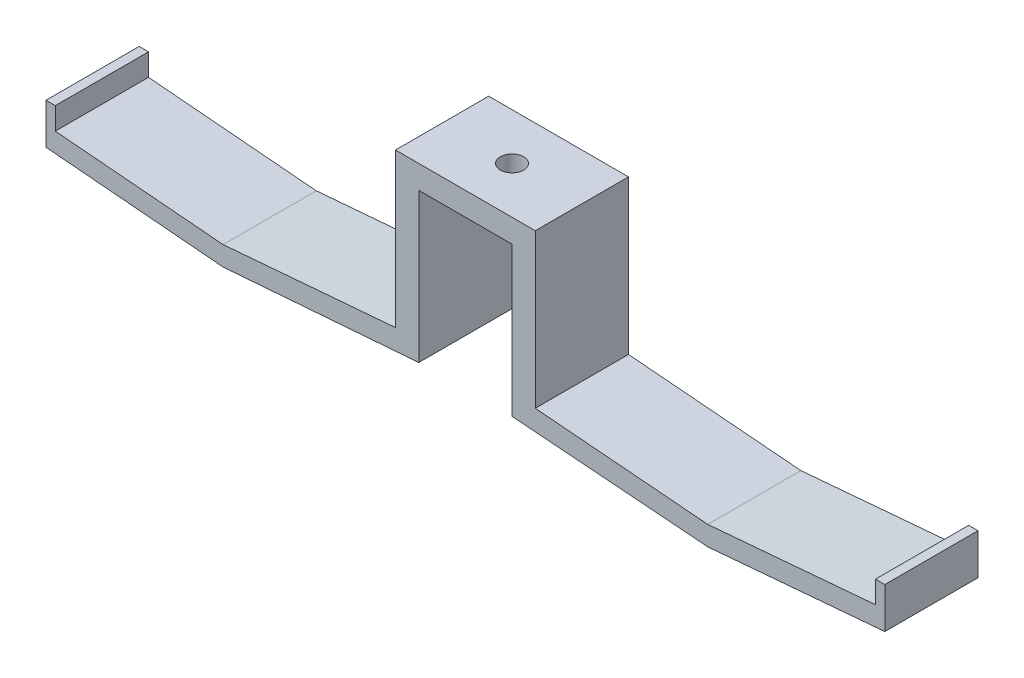
ISO-10303-21;
HEADER;
FILE_DESCRIPTION(('STEP AP214'),'2;1');
FILE_NAME('part.step','',(''),(''),'','','');
FILE_SCHEMA(('AUTOMOTIVE_DESIGN { 1 0 10303 214 1 1 1 1 }'));
ENDSEC;
DATA;
#1=APPLICATION_CONTEXT('core data for automotive mechanical design processes');
#2=APPLICATION_PROTOCOL_DEFINITION('international standard','automotive_design',2000,#1);
#3=PRODUCT_CONTEXT('',#1,'mechanical');
#4=PRODUCT('Part','Part','',(#3));
#5=PRODUCT_RELATED_PRODUCT_CATEGORY('part','',(#4));
#6=PRODUCT_DEFINITION_FORMATION('','',#4);
#7=PRODUCT_DEFINITION_CONTEXT('part definition',#1,'design');
#8=PRODUCT_DEFINITION('design','',#6,#7);
#9=PRODUCT_DEFINITION_SHAPE('','',#8);
#10=(LENGTH_UNIT() NAMED_UNIT(*) SI_UNIT(.MILLI.,.METRE.));
#11=(NAMED_UNIT(*) PLANE_ANGLE_UNIT() SI_UNIT($,.RADIAN.));
#12=(NAMED_UNIT(*) SI_UNIT($,.STERADIAN.) SOLID_ANGLE_UNIT());
#13=UNCERTAINTY_MEASURE_WITH_UNIT(LENGTH_MEASURE(1.E-05),#10,'distance_accuracy_value','');
#14=(GEOMETRIC_REPRESENTATION_CONTEXT(3) GLOBAL_UNCERTAINTY_ASSIGNED_CONTEXT((#13)) GLOBAL_UNIT_ASSIGNED_CONTEXT((#10,
#11,#12)) REPRESENTATION_CONTEXT('',''));
#15=CARTESIAN_POINT('',(0.,0.,0.));
#16=DIRECTION('',(0.,0.,1.));
#17=DIRECTION('',(1.,0.,0.));
#18=AXIS2_PLACEMENT_3D('',#15,#16,#17);
#19=CARTESIAN_POINT('',(-2.81151729848972,-33.7382068524024,25.4000000000001));
#20=DIRECTION('',(0.0830454816369341,0.99654575809628,0.));
#21=DIRECTION('',(-0.99654575809628,0.0830454816369341,0.));
#22=AXIS2_PLACEMENT_3D('',#19,#20,#21);
#23=PLANE('',#22);
#24=DIRECTION('',(0.99654575809628,-0.0830454816369341,0.));
#25=VECTOR('',#24,1.);
#26=CARTESIAN_POINT('',(-2.81151729848972,-33.7382068524024,0.));
#27=LINE('',#26,#25);
#28=CARTESIAN_POINT('',(19.05,-35.56,0.));
#29=VERTEX_POINT('',#28);
#30=CARTESIAN_POINT('',(66.0400000000001,-39.4758334179999,0.));
#31=VERTEX_POINT('',#30);
#32=EDGE_CURVE('E204',#29,#31,#27,.T.);
#33=ORIENTED_EDGE('',*,*,#32,.F.);
#34=DIRECTION('',(0.,0.,-1.));
#35=VECTOR('',#34,1.);
#36=CARTESIAN_POINT('',(19.05,-35.56,25.4000000000001));
#37=LINE('',#36,#35);
#38=CARTESIAN_POINT('',(19.05,-35.56,25.4000000000001));
#39=VERTEX_POINT('',#38);
#40=EDGE_CURVE('E11',#39,#29,#37,.T.);
#41=ORIENTED_EDGE('',*,*,#40,.F.);
#42=DIRECTION('',(0.99654575809628,-0.0830454816369341,0.));
#43=VECTOR('',#42,1.);
#44=CARTESIAN_POINT('',(-2.81151729848972,-33.7382068524024,25.4000000000001));
#45=LINE('',#44,#43);
#46=CARTESIAN_POINT('',(66.0400000000001,-39.4758334179999,25.4000000000001));
#47=VERTEX_POINT('',#46);
#48=EDGE_CURVE('E254',#39,#47,#45,.T.);
#49=ORIENTED_EDGE('',*,*,#48,.T.);
#50=DIRECTION('',(0.,0.,-1.));
#51=VECTOR('',#50,1.);
#52=CARTESIAN_POINT('',(66.0400000000001,-39.4758334179999,25.4000000000001));
#53=LINE('',#52,#51);
#54=EDGE_CURVE('E127',#47,#31,#53,.T.);
#55=ORIENTED_EDGE('',*,*,#54,.T.);
#56=EDGE_LOOP('',(#33,#41,#49,#55));
#57=FACE_BOUND('',#56,.T.);
#58=ADVANCED_FACE('F40',(#57),#23,.T.);
#59=CARTESIAN_POINT('',(19.05,0.,25.4000000000001));
#60=DIRECTION('',(1.,0.,0.));
#61=DIRECTION('',(0.,1.,0.));
#62=AXIS2_PLACEMENT_3D('',#59,#60,#61);
#63=PLANE('',#62);
#64=DIRECTION('',(0.,-1.,0.));
#65=VECTOR('',#64,1.);
#66=CARTESIAN_POINT('',(19.05,0.,0.));
#67=LINE('',#66,#65);
#68=CARTESIAN_POINT('',(19.05,6.35000000000008,0.));
#69=VERTEX_POINT('',#68);
#70=EDGE_CURVE('E207',#69,#29,#67,.T.);
#71=ORIENTED_EDGE('',*,*,#70,.F.);
#72=DIRECTION('',(0.,0.,-1.));
#73=VECTOR('',#72,1.);
#74=CARTESIAN_POINT('',(19.05,6.35000000000008,25.4000000000001));
#75=LINE('',#74,#73);
#76=CARTESIAN_POINT('',(19.05,6.35000000000008,25.4000000000001));
#77=VERTEX_POINT('',#76);
#78=EDGE_CURVE('E48',#77,#69,#75,.T.);
#79=ORIENTED_EDGE('',*,*,#78,.F.);
#80=DIRECTION('',(0.,-1.,0.));
#81=VECTOR('',#80,1.);
#82=CARTESIAN_POINT('',(19.05,0.,25.4000000000001));
#83=LINE('',#82,#81);
#84=EDGE_CURVE('E305',#77,#39,#83,.T.);
#85=ORIENTED_EDGE('',*,*,#84,.T.);
#86=ORIENTED_EDGE('',*,*,#40,.T.);
#87=EDGE_LOOP('',(#71,#79,#85,#86));
#88=FACE_BOUND('',#87,.T.);
#89=ADVANCED_FACE('F304',(#88),#63,.T.);
#90=CARTESIAN_POINT('',(0.,6.35000000000008,25.4000000000001));
#91=DIRECTION('',(0.,-1.,0.));
#92=DIRECTION('',(1.,0.,0.));
#93=AXIS2_PLACEMENT_3D('',#90,#91,#92);
#94=PLANE('',#93);
#95=CARTESIAN_POINT('',(0.,6.35000000000008,12.6999999999999));
#96=DIRECTION('',(0.,1.,0.));
#97=DIRECTION('',(-1.,0.,0.));
#98=AXIS2_PLACEMENT_3D('',#95,#96,#97);
#99=CIRCLE('',#98,3.175);
#100=CARTESIAN_POINT('',(-3.175,6.35000000000008,12.6999999999999));
#101=VERTEX_POINT('',#100);
#102=EDGE_CURVE('E208',#101,#101,#99,.T.);
#103=ORIENTED_EDGE('',*,*,#102,.F.);
#104=EDGE_LOOP('',(#103));
#105=FACE_BOUND('',#104,.T.);
#106=DIRECTION('',(-1.,0.,0.));
#107=VECTOR('',#106,1.);
#108=CARTESIAN_POINT('',(0.,6.35000000000008,0.));
#109=LINE('',#108,#107);
#110=CARTESIAN_POINT('',(-19.05,6.35000000000008,0.));
#111=VERTEX_POINT('',#110);
#112=EDGE_CURVE('E211',#69,#111,#109,.T.);
#113=ORIENTED_EDGE('',*,*,#112,.T.);
#114=DIRECTION('',(0.,0.,-1.));
#115=VECTOR('',#114,1.);
#116=CARTESIAN_POINT('',(-19.05,6.35000000000008,25.4000000000001));
#117=LINE('',#116,#115);
#118=CARTESIAN_POINT('',(-19.05,6.35000000000008,25.4000000000001));
#119=VERTEX_POINT('',#118);
#120=EDGE_CURVE('E288',#119,#111,#117,.T.);
#121=ORIENTED_EDGE('',*,*,#120,.F.);
#122=DIRECTION('',(-1.,0.,0.));
#123=VECTOR('',#122,1.);
#124=CARTESIAN_POINT('',(0.,6.35000000000008,25.4000000000001));
#125=LINE('',#124,#123);
#126=EDGE_CURVE('E295',#77,#119,#125,.T.);
#127=ORIENTED_EDGE('',*,*,#126,.F.);
#128=ORIENTED_EDGE('',*,*,#78,.T.);
#129=EDGE_LOOP('',(#113,#121,#127,#128));
#130=FACE_BOUND('',#129,.T.);
#131=ADVANCED_FACE('F293',(#105,#130),#94,.F.);
#132=CARTESIAN_POINT('',(-19.05,0.,25.4000000000001));
#133=DIRECTION('',(1.,0.,0.));
#134=DIRECTION('',(0.,1.,0.));
#135=AXIS2_PLACEMENT_3D('',#132,#133,#134);
#136=PLANE('',#135);
#137=DIRECTION('',(0.,-1.,0.));
#138=VECTOR('',#137,1.);
#139=CARTESIAN_POINT('',(-19.05,0.,0.));
#140=LINE('',#139,#138);
#141=CARTESIAN_POINT('',(-19.05,-35.56,0.));
#142=VERTEX_POINT('',#141);
#143=EDGE_CURVE('E213',#111,#142,#140,.T.);
#144=ORIENTED_EDGE('',*,*,#143,.T.);
#145=DIRECTION('',(0.,0.,-1.));
#146=VECTOR('',#145,1.);
#147=CARTESIAN_POINT('',(-19.05,-35.56,25.4000000000001));
#148=LINE('',#147,#146);
#149=CARTESIAN_POINT('',(-19.05,-35.56,25.4000000000001));
#150=VERTEX_POINT('',#149);
#151=EDGE_CURVE('E285',#150,#142,#148,.T.);
#152=ORIENTED_EDGE('',*,*,#151,.F.);
#153=DIRECTION('',(0.,-1.,0.));
#154=VECTOR('',#153,1.);
#155=CARTESIAN_POINT('',(-19.05,0.,25.4000000000001));
#156=LINE('',#155,#154);
#157=EDGE_CURVE('E316',#119,#150,#156,.T.);
#158=ORIENTED_EDGE('',*,*,#157,.F.);
#159=ORIENTED_EDGE('',*,*,#120,.T.);
#160=EDGE_LOOP('',(#144,#152,#158,#159));
#161=FACE_BOUND('',#160,.T.);
#162=ADVANCED_FACE('F406',(#161),#136,.F.);
#163=CARTESIAN_POINT('',(2.81151729848972,-33.7382068524024,25.4000000000001));
#164=DIRECTION('',(0.0830454816369343,-0.99654575809628,0.));
#165=DIRECTION('',(0.99654575809628,0.0830454816369343,0.));
#166=AXIS2_PLACEMENT_3D('',#163,#164,#165);
#167=PLANE('',#166);
#168=DIRECTION('',(-0.99654575809628,-0.0830454816369343,0.));
#169=VECTOR('',#168,1.);
#170=CARTESIAN_POINT('',(2.81151729848972,-33.7382068524024,0.));
#171=LINE('',#170,#169);
#172=CARTESIAN_POINT('',(-66.04,-39.4758334179999,0.));
#173=VERTEX_POINT('',#172);
#174=EDGE_CURVE('E215',#142,#173,#171,.T.);
#175=ORIENTED_EDGE('',*,*,#174,.T.);
#176=DIRECTION('',(0.,0.,-1.));
#177=VECTOR('',#176,1.);
#178=CARTESIAN_POINT('',(-66.04,-39.4758334179999,25.4000000000001));
#179=LINE('',#178,#177);
#180=CARTESIAN_POINT('',(-66.04,-39.4758334179999,25.4000000000001));
#181=VERTEX_POINT('',#180);
#182=EDGE_CURVE('E283',#181,#173,#179,.T.);
#183=ORIENTED_EDGE('',*,*,#182,.F.);
#184=DIRECTION('',(-0.99654575809628,-0.0830454816369343,0.));
#185=VECTOR('',#184,1.);
#186=CARTESIAN_POINT('',(2.81151729848972,-33.7382068524024,25.4000000000001));
#187=LINE('',#186,#185);
#188=EDGE_CURVE('E318',#150,#181,#187,.T.);
#189=ORIENTED_EDGE('',*,*,#188,.F.);
#190=ORIENTED_EDGE('',*,*,#151,.T.);
#191=EDGE_LOOP('',(#175,#183,#189,#190));
#192=FACE_BOUND('',#191,.T.);
#193=ADVANCED_FACE('F402',(#192),#167,.F.);
#194=CARTESIAN_POINT('',(-3.83732638278311,-44.8033773383685,25.4000000000001));
#195=DIRECTION('',(0.0853357272861369,0.996352253798096,0.));
#196=DIRECTION('',(-0.996352253798096,0.0853357272861369,0.));
#197=AXIS2_PLACEMENT_3D('',#194,#195,#196);
#198=PLANE('',#197);
#199=DIRECTION('',(0.996352253798096,-0.0853357272861369,0.));
#200=VECTOR('',#199,1.);
#201=CARTESIAN_POINT('',(-3.83732638278311,-44.8033773383685,0.));
#202=LINE('',#201,#200);
#203=CARTESIAN_POINT('',(-111.76,-35.56,0.));
#204=VERTEX_POINT('',#203);
#205=EDGE_CURVE('E218',#204,#173,#202,.T.);
#206=ORIENTED_EDGE('',*,*,#205,.F.);
#207=DIRECTION('',(0.,0.,-1.));
#208=VECTOR('',#207,1.);
#209=CARTESIAN_POINT('',(-111.76,-35.56,25.4000000000001));
#210=LINE('',#209,#208);
#211=CARTESIAN_POINT('',(-111.76,-35.56,25.4000000000001));
#212=VERTEX_POINT('',#211);
#213=EDGE_CURVE('E281',#212,#204,#210,.T.);
#214=ORIENTED_EDGE('',*,*,#213,.F.);
#215=DIRECTION('',(0.996352253798096,-0.0853357272861369,0.));
#216=VECTOR('',#215,1.);
#217=CARTESIAN_POINT('',(-3.83732638278311,-44.8033773383685,25.4000000000001));
#218=LINE('',#217,#216);
#219=EDGE_CURVE('E320',#212,#181,#218,.T.);
#220=ORIENTED_EDGE('',*,*,#219,.T.);
#221=ORIENTED_EDGE('',*,*,#182,.T.);
#222=EDGE_LOOP('',(#206,#214,#220,#221));
#223=FACE_BOUND('',#222,.T.);
#224=ADVANCED_FACE('F397',(#223),#198,.T.);
#225=CARTESIAN_POINT('',(-111.76,-4.44089209850063E-13,25.4000000000001));
#226=DIRECTION('',(1.,0.,0.));
#227=DIRECTION('',(0.,1.,0.));
#228=AXIS2_PLACEMENT_3D('',#225,#226,#227);
#229=PLANE('',#228);
#230=DIRECTION('',(0.,-1.,0.));
#231=VECTOR('',#230,1.);
#232=CARTESIAN_POINT('',(-111.76,-4.44089209850063E-13,0.));
#233=LINE('',#232,#231);
#234=CARTESIAN_POINT('',(-111.76,-29.5333797190001,0.));
#235=VERTEX_POINT('',#234);
#236=EDGE_CURVE('E221',#235,#204,#233,.T.);
#237=ORIENTED_EDGE('',*,*,#236,.F.);
#238=DIRECTION('',(0.,0.,-1.));
#239=VECTOR('',#238,1.);
#240=CARTESIAN_POINT('',(-111.76,-29.5333797190001,25.4000000000001));
#241=LINE('',#240,#239);
#242=CARTESIAN_POINT('',(-111.76,-29.5333797190001,25.4000000000001));
#243=VERTEX_POINT('',#242);
#244=EDGE_CURVE('E279',#243,#235,#241,.T.);
#245=ORIENTED_EDGE('',*,*,#244,.F.);
#246=DIRECTION('',(0.,-1.,0.));
#247=VECTOR('',#246,1.);
#248=CARTESIAN_POINT('',(-111.76,-4.44089209850063E-13,25.4000000000001));
#249=LINE('',#248,#247);
#250=EDGE_CURVE('E323',#243,#212,#249,.T.);
#251=ORIENTED_EDGE('',*,*,#250,.T.);
#252=ORIENTED_EDGE('',*,*,#213,.T.);
#253=EDGE_LOOP('',(#237,#245,#251,#252));
#254=FACE_BOUND('',#253,.T.);
#255=ADVANCED_FACE('F394',(#254),#229,.T.);
#256=CARTESIAN_POINT('',(0.,-29.5333797190001,25.4000000000001));
#257=DIRECTION('',(0.,1.,0.));
#258=DIRECTION('',(0.,0.,1.));
#259=AXIS2_PLACEMENT_3D('',#256,#257,#258);
#260=PLANE('',#259);
#261=DIRECTION('',(1.,0.,0.));
#262=VECTOR('',#261,1.);
#263=CARTESIAN_POINT('',(0.,-29.5333797190001,0.));
#264=LINE('',#263,#262);
#265=CARTESIAN_POINT('',(-114.3,-29.5333797190001,0.));
#266=VERTEX_POINT('',#265);
#267=EDGE_CURVE('E224',#266,#235,#264,.T.);
#268=ORIENTED_EDGE('',*,*,#267,.F.);
#269=DIRECTION('',(0.,0.,-1.));
#270=VECTOR('',#269,1.);
#271=CARTESIAN_POINT('',(-114.3,-29.5333797190001,25.4000000000001));
#272=LINE('',#271,#270);
#273=CARTESIAN_POINT('',(-114.3,-29.5333797190001,25.4000000000001));
#274=VERTEX_POINT('',#273);
#275=EDGE_CURVE('E277',#274,#266,#272,.T.);
#276=ORIENTED_EDGE('',*,*,#275,.F.);
#277=DIRECTION('',(1.,0.,0.));
#278=VECTOR('',#277,1.);
#279=CARTESIAN_POINT('',(0.,-29.5333797190001,25.4000000000001));
#280=LINE('',#279,#278);
#281=EDGE_CURVE('E326',#274,#243,#280,.T.);
#282=ORIENTED_EDGE('',*,*,#281,.T.);
#283=ORIENTED_EDGE('',*,*,#244,.T.);
#284=EDGE_LOOP('',(#268,#276,#282,#283));
#285=FACE_BOUND('',#284,.T.);
#286=ADVANCED_FACE('F390',(#285),#260,.T.);
#287=CARTESIAN_POINT('',(-114.3,0.,25.4000000000001));
#288=DIRECTION('',(-1.,0.,0.));
#289=DIRECTION('',(0.,0.,1.));
#290=AXIS2_PLACEMENT_3D('',#287,#288,#289);
#291=PLANE('',#290);
#292=DIRECTION('',(0.,1.,0.));
#293=VECTOR('',#292,1.);
#294=CARTESIAN_POINT('',(-114.3,0.,0.));
#295=LINE('',#294,#293);
#296=CARTESIAN_POINT('',(-114.3,-40.64,0.));
#297=VERTEX_POINT('',#296);
#298=EDGE_CURVE('E227',#297,#266,#295,.T.);
#299=ORIENTED_EDGE('',*,*,#298,.F.);
#300=DIRECTION('',(0.,0.,-1.));
#301=VECTOR('',#300,1.);
#302=CARTESIAN_POINT('',(-114.3,-40.64,25.4000000000001));
#303=LINE('',#302,#301);
#304=CARTESIAN_POINT('',(-114.3,-40.64,25.4000000000001));
#305=VERTEX_POINT('',#304);
#306=EDGE_CURVE('E275',#305,#297,#303,.T.);
#307=ORIENTED_EDGE('',*,*,#306,.F.);
#308=DIRECTION('',(0.,1.,0.));
#309=VECTOR('',#308,1.);
#310=CARTESIAN_POINT('',(-114.3,0.,25.4000000000001));
#311=LINE('',#310,#309);
#312=EDGE_CURVE('E329',#305,#274,#311,.T.);
#313=ORIENTED_EDGE('',*,*,#312,.T.);
#314=ORIENTED_EDGE('',*,*,#275,.T.);
#315=EDGE_LOOP('',(#299,#307,#313,#314));
#316=FACE_BOUND('',#315,.T.);
#317=ADVANCED_FACE('F386',(#316),#291,.T.);
#318=CARTESIAN_POINT('',(-4.28774731270787,-50.0623459199989,25.4000000000001));
#319=DIRECTION('',(-0.0853357272861369,-0.996352253798096,0.));
#320=DIRECTION('',(0.996352253798096,-0.0853357272861369,0.));
#321=AXIS2_PLACEMENT_3D('',#318,#319,#320);
#322=PLANE('',#321);
#323=DIRECTION('',(-0.996352253798096,0.085335727286137,0.));
#324=VECTOR('',#323,1.);
#325=CARTESIAN_POINT('',(-4.28774731270787,-50.0623459199989,0.));
#326=LINE('',#325,#324);
#327=CARTESIAN_POINT('',(-66.04,-44.773379719,0.));
#328=VERTEX_POINT('',#327);
#329=EDGE_CURVE('E230',#328,#297,#326,.T.);
#330=ORIENTED_EDGE('',*,*,#329,.F.);
#331=DIRECTION('',(0.,0.,-1.));
#332=VECTOR('',#331,1.);
#333=CARTESIAN_POINT('',(-66.04,-44.773379719,25.4000000000001));
#334=LINE('',#333,#332);
#335=CARTESIAN_POINT('',(-66.04,-44.773379719,25.4000000000001));
#336=VERTEX_POINT('',#335);
#337=EDGE_CURVE('E273',#336,#328,#334,.T.);
#338=ORIENTED_EDGE('',*,*,#337,.F.);
#339=DIRECTION('',(-0.996352253798096,0.085335727286137,0.));
#340=VECTOR('',#339,1.);
#341=CARTESIAN_POINT('',(-4.28774731270787,-50.0623459199989,25.4000000000001));
#342=LINE('',#341,#340);
#343=EDGE_CURVE('E332',#336,#305,#342,.T.);
#344=ORIENTED_EDGE('',*,*,#343,.T.);
#345=ORIENTED_EDGE('',*,*,#306,.T.);
#346=EDGE_LOOP('',(#330,#338,#344,#345));
#347=FACE_BOUND('',#346,.T.);
#348=ADVANCED_FACE('F382',(#347),#322,.T.);
#349=CARTESIAN_POINT('',(3.05463693139707,-39.419154541199,25.4000000000001));
#350=DIRECTION('',(0.0772595631880114,-0.997011012926135,0.));
#351=DIRECTION('',(0.997011012926135,0.0772595631880114,0.));
#352=AXIS2_PLACEMENT_3D('',#349,#350,#351);
#353=PLANE('',#352);
#354=DIRECTION('',(-0.997011012926135,-0.0772595631880114,0.));
#355=VECTOR('',#354,1.);
#356=CARTESIAN_POINT('',(3.05463693139707,-39.419154541199,0.));
#357=LINE('',#356,#355);
#358=CARTESIAN_POINT('',(-12.6999999999999,-40.64,0.));
#359=VERTEX_POINT('',#358);
#360=EDGE_CURVE('E233',#359,#328,#357,.T.);
#361=ORIENTED_EDGE('',*,*,#360,.F.);
#362=DIRECTION('',(0.,0.,-1.));
#363=VECTOR('',#362,1.);
#364=CARTESIAN_POINT('',(-12.6999999999999,-40.64,25.4000000000001));
#365=LINE('',#364,#363);
#366=CARTESIAN_POINT('',(-12.6999999999999,-40.64,25.4000000000001));
#367=VERTEX_POINT('',#366);
#368=EDGE_CURVE('E271',#367,#359,#365,.T.);
#369=ORIENTED_EDGE('',*,*,#368,.F.);
#370=DIRECTION('',(-0.997011012926135,-0.0772595631880114,0.));
#371=VECTOR('',#370,1.);
#372=CARTESIAN_POINT('',(3.05463693139707,-39.419154541199,25.4000000000001));
#373=LINE('',#372,#371);
#374=EDGE_CURVE('E335',#367,#336,#373,.T.);
#375=ORIENTED_EDGE('',*,*,#374,.T.);
#376=ORIENTED_EDGE('',*,*,#337,.T.);
#377=EDGE_LOOP('',(#361,#369,#375,#376));
#378=FACE_BOUND('',#377,.T.);
#379=ADVANCED_FACE('F378',(#378),#353,.T.);
#380=CARTESIAN_POINT('',(-12.6999999999999,0.,25.4000000000001));
#381=DIRECTION('',(1.,0.,0.));
#382=DIRECTION('',(0.,1.,0.));
#383=AXIS2_PLACEMENT_3D('',#380,#381,#382);
#384=PLANE('',#383);
#385=DIRECTION('',(0.,-1.,0.));
#386=VECTOR('',#385,1.);
#387=CARTESIAN_POINT('',(-12.6999999999999,0.,0.));
#388=LINE('',#387,#386);
#389=CARTESIAN_POINT('',(-12.6999999999999,0.,0.));
#390=VERTEX_POINT('',#389);
#391=EDGE_CURVE('E236',#390,#359,#388,.T.);
#392=ORIENTED_EDGE('',*,*,#391,.F.);
#393=DIRECTION('',(0.,0.,-1.));
#394=VECTOR('',#393,1.);
#395=CARTESIAN_POINT('',(-12.6999999999999,0.,25.4000000000001));
#396=LINE('',#395,#394);
#397=CARTESIAN_POINT('',(-12.6999999999999,0.,25.4000000000001));
#398=VERTEX_POINT('',#397);
#399=EDGE_CURVE('E269',#398,#390,#396,.T.);
#400=ORIENTED_EDGE('',*,*,#399,.F.);
#401=DIRECTION('',(0.,-1.,0.));
#402=VECTOR('',#401,1.);
#403=CARTESIAN_POINT('',(-12.6999999999999,0.,25.4000000000001));
#404=LINE('',#403,#402);
#405=EDGE_CURVE('E338',#398,#367,#404,.T.);
#406=ORIENTED_EDGE('',*,*,#405,.T.);
#407=ORIENTED_EDGE('',*,*,#368,.T.);
#408=EDGE_LOOP('',(#392,#400,#406,#407));
#409=FACE_BOUND('',#408,.T.);
#410=ADVANCED_FACE('F374',(#409),#384,.T.);
#411=CARTESIAN_POINT('',(0.,0.,25.4000000000001));
#412=DIRECTION('',(0.,-1.,0.));
#413=DIRECTION('',(0.,0.,-1.));
#414=AXIS2_PLACEMENT_3D('',#411,#412,#413);
#415=PLANE('',#414);
#416=CARTESIAN_POINT('',(0.,0.,12.6999999999999));
#417=DIRECTION('',(0.,-1.,0.));
#418=DIRECTION('',(0.,0.,-1.));
#419=AXIS2_PLACEMENT_3D('',#416,#417,#418);
#420=CIRCLE('',#419,3.175);
#421=CARTESIAN_POINT('',(0.,0.,9.52499999999993));
#422=VERTEX_POINT('',#421);
#423=EDGE_CURVE('E312',#422,#422,#420,.F.);
#424=ORIENTED_EDGE('',*,*,#423,.T.);
#425=EDGE_LOOP('',(#424));
#426=FACE_BOUND('',#425,.T.);
#427=DIRECTION('',(-1.,0.,0.));
#428=VECTOR('',#427,1.);
#429=CARTESIAN_POINT('',(0.,0.,0.));
#430=LINE('',#429,#428);
#431=CARTESIAN_POINT('',(12.6999999999999,0.,0.));
#432=VERTEX_POINT('',#431);
#433=EDGE_CURVE('E239',#432,#390,#430,.T.);
#434=ORIENTED_EDGE('',*,*,#433,.F.);
#435=DIRECTION('',(0.,0.,-1.));
#436=VECTOR('',#435,1.);
#437=CARTESIAN_POINT('',(12.6999999999999,0.,25.4000000000001));
#438=LINE('',#437,#436);
#439=CARTESIAN_POINT('',(12.6999999999999,0.,25.4000000000001));
#440=VERTEX_POINT('',#439);
#441=EDGE_CURVE('E267',#440,#432,#438,.T.);
#442=ORIENTED_EDGE('',*,*,#441,.F.);
#443=DIRECTION('',(-1.,0.,0.));
#444=VECTOR('',#443,1.);
#445=CARTESIAN_POINT('',(0.,0.,25.4000000000001));
#446=LINE('',#445,#444);
#447=EDGE_CURVE('E341',#440,#398,#446,.T.);
#448=ORIENTED_EDGE('',*,*,#447,.T.);
#449=ORIENTED_EDGE('',*,*,#399,.T.);
#450=EDGE_LOOP('',(#434,#442,#448,#449));
#451=FACE_BOUND('',#450,.T.);
#452=ADVANCED_FACE('F370',(#426,#451),#415,.T.);
#453=CARTESIAN_POINT('',(12.6999999999999,0.,25.4000000000001));
#454=DIRECTION('',(1.,0.,0.));
#455=DIRECTION('',(0.,1.,0.));
#456=AXIS2_PLACEMENT_3D('',#453,#454,#455);
#457=PLANE('',#456);
#458=DIRECTION('',(0.,-1.,0.));
#459=VECTOR('',#458,1.);
#460=CARTESIAN_POINT('',(12.6999999999999,0.,0.));
#461=LINE('',#460,#459);
#462=CARTESIAN_POINT('',(12.6999999999999,-40.64,0.));
#463=VERTEX_POINT('',#462);
#464=EDGE_CURVE('E242',#432,#463,#461,.T.);
#465=ORIENTED_EDGE('',*,*,#464,.T.);
#466=DIRECTION('',(0.,0.,-1.));
#467=VECTOR('',#466,1.);
#468=CARTESIAN_POINT('',(12.6999999999999,-40.64,25.4000000000001));
#469=LINE('',#468,#467);
#470=CARTESIAN_POINT('',(12.6999999999999,-40.64,25.4000000000001));
#471=VERTEX_POINT('',#470);
#472=EDGE_CURVE('E264',#471,#463,#469,.T.);
#473=ORIENTED_EDGE('',*,*,#472,.F.);
#474=DIRECTION('',(0.,-1.,0.));
#475=VECTOR('',#474,1.);
#476=CARTESIAN_POINT('',(12.6999999999999,0.,25.4000000000001));
#477=LINE('',#476,#475);
#478=EDGE_CURVE('E344',#440,#471,#477,.T.);
#479=ORIENTED_EDGE('',*,*,#478,.F.);
#480=ORIENTED_EDGE('',*,*,#441,.T.);
#481=EDGE_LOOP('',(#465,#473,#479,#480));
#482=FACE_BOUND('',#481,.T.);
#483=ADVANCED_FACE('F367',(#482),#457,.F.);
#484=CARTESIAN_POINT('',(-3.05463693139707,-39.419154541199,25.4000000000001));
#485=DIRECTION('',(0.0772595631880112,0.997011012926135,0.));
#486=DIRECTION('',(-0.997011012926135,0.0772595631880112,0.));
#487=AXIS2_PLACEMENT_3D('',#484,#485,#486);
#488=PLANE('',#487);
#489=DIRECTION('',(0.997011012926135,-0.0772595631880112,0.));
#490=VECTOR('',#489,1.);
#491=CARTESIAN_POINT('',(-3.05463693139707,-39.419154541199,0.));
#492=LINE('',#491,#490);
#493=CARTESIAN_POINT('',(66.0400000000001,-44.773379719,0.));
#494=VERTEX_POINT('',#493);
#495=EDGE_CURVE('E244',#463,#494,#492,.T.);
#496=ORIENTED_EDGE('',*,*,#495,.T.);
#497=DIRECTION('',(0.,0.,-1.));
#498=VECTOR('',#497,1.);
#499=CARTESIAN_POINT('',(66.0400000000001,-44.773379719,25.4000000000001));
#500=LINE('',#499,#498);
#501=CARTESIAN_POINT('',(66.0400000000001,-44.773379719,25.4000000000001));
#502=VERTEX_POINT('',#501);
#503=EDGE_CURVE('E261',#502,#494,#500,.T.);
#504=ORIENTED_EDGE('',*,*,#503,.F.);
#505=DIRECTION('',(0.997011012926135,-0.0772595631880112,0.));
#506=VECTOR('',#505,1.);
#507=CARTESIAN_POINT('',(-3.05463693139707,-39.419154541199,25.4000000000001));
#508=LINE('',#507,#506);
#509=EDGE_CURVE('E346',#471,#502,#508,.T.);
#510=ORIENTED_EDGE('',*,*,#509,.F.);
#511=ORIENTED_EDGE('',*,*,#472,.T.);
#512=EDGE_LOOP('',(#496,#504,#510,#511));
#513=FACE_BOUND('',#512,.T.);
#514=ADVANCED_FACE('F363',(#513),#488,.F.);
#515=CARTESIAN_POINT('',(4.28774731270787,-50.0623459199989,25.4000000000001));
#516=DIRECTION('',(-0.0853357272861372,0.996352253798096,0.));
#517=DIRECTION('',(-0.996352253798096,-0.0853357272861372,0.));
#518=AXIS2_PLACEMENT_3D('',#515,#516,#517);
#519=PLANE('',#518);
#520=DIRECTION('',(0.996352253798096,0.0853357272861372,0.));
#521=VECTOR('',#520,1.);
#522=CARTESIAN_POINT('',(4.28774731270787,-50.0623459199989,0.));
#523=LINE('',#522,#521);
#524=CARTESIAN_POINT('',(114.3,-40.64,0.));
#525=VERTEX_POINT('',#524);
#526=EDGE_CURVE('E246',#494,#525,#523,.T.);
#527=ORIENTED_EDGE('',*,*,#526,.T.);
#528=DIRECTION('',(0.,0.,-1.));
#529=VECTOR('',#528,1.);
#530=CARTESIAN_POINT('',(114.3,-40.64,25.4000000000001));
#531=LINE('',#530,#529);
#532=CARTESIAN_POINT('',(114.3,-40.64,25.4000000000001));
#533=VERTEX_POINT('',#532);
#534=EDGE_CURVE('E258',#533,#525,#531,.T.);
#535=ORIENTED_EDGE('',*,*,#534,.F.);
#536=DIRECTION('',(0.996352253798096,0.0853357272861372,0.));
#537=VECTOR('',#536,1.);
#538=CARTESIAN_POINT('',(4.28774731270787,-50.0623459199989,25.4000000000001));
#539=LINE('',#538,#537);
#540=EDGE_CURVE('E348',#502,#533,#539,.T.);
#541=ORIENTED_EDGE('',*,*,#540,.F.);
#542=ORIENTED_EDGE('',*,*,#503,.T.);
#543=EDGE_LOOP('',(#527,#535,#541,#542));
#544=FACE_BOUND('',#543,.T.);
#545=ADVANCED_FACE('F354',(#544),#519,.F.);
#546=CARTESIAN_POINT('',(114.3,0.,25.4000000000001));
#547=DIRECTION('',(-1.,0.,0.));
#548=DIRECTION('',(0.,0.,1.));
#549=AXIS2_PLACEMENT_3D('',#546,#547,#548);
#550=PLANE('',#549);
#551=DIRECTION('',(0.,1.,0.));
#552=VECTOR('',#551,1.);
#553=CARTESIAN_POINT('',(114.3,0.,0.));
#554=LINE('',#553,#552);
#555=CARTESIAN_POINT('',(114.3,-29.5333797190001,0.));
#556=VERTEX_POINT('',#555);
#557=EDGE_CURVE('E248',#525,#556,#554,.T.);
#558=ORIENTED_EDGE('',*,*,#557,.T.);
#559=DIRECTION('',(0.,0.,-1.));
#560=VECTOR('',#559,1.);
#561=CARTESIAN_POINT('',(114.3,-29.5333797190001,25.4000000000001));
#562=LINE('',#561,#560);
#563=CARTESIAN_POINT('',(114.3,-29.5333797190001,25.4000000000001));
#564=VERTEX_POINT('',#563);
#565=EDGE_CURVE('E196',#564,#556,#562,.T.);
#566=ORIENTED_EDGE('',*,*,#565,.F.);
#567=DIRECTION('',(0.,1.,0.));
#568=VECTOR('',#567,1.);
#569=CARTESIAN_POINT('',(114.3,0.,25.4000000000001));
#570=LINE('',#569,#568);
#571=EDGE_CURVE('E187',#533,#564,#570,.T.);
#572=ORIENTED_EDGE('',*,*,#571,.F.);
#573=ORIENTED_EDGE('',*,*,#534,.T.);
#574=EDGE_LOOP('',(#558,#566,#572,#573));
#575=FACE_BOUND('',#574,.T.);
#576=ADVANCED_FACE('F358',(#575),#550,.F.);
#577=CARTESIAN_POINT('',(0.,-29.5333797190001,25.4000000000001));
#578=DIRECTION('',(0.,-1.,0.));
#579=DIRECTION('',(0.,0.,-1.));
#580=AXIS2_PLACEMENT_3D('',#577,#578,#579);
#581=PLANE('',#580);
#582=DIRECTION('',(-1.,0.,0.));
#583=VECTOR('',#582,1.);
#584=CARTESIAN_POINT('',(0.,-29.5333797190001,0.));
#585=LINE('',#584,#583);
#586=CARTESIAN_POINT('',(111.76,-29.5333797190001,0.));
#587=VERTEX_POINT('',#586);
#588=EDGE_CURVE('E195',#556,#587,#585,.T.);
#589=ORIENTED_EDGE('',*,*,#588,.T.);
#590=DIRECTION('',(0.,0.,-1.));
#591=VECTOR('',#590,1.);
#592=CARTESIAN_POINT('',(111.76,-29.5333797190001,25.4000000000001));
#593=LINE('',#592,#591);
#594=CARTESIAN_POINT('',(111.76,-29.5333797190001,25.4000000000001));
#595=VERTEX_POINT('',#594);
#596=EDGE_CURVE('E192',#595,#587,#593,.T.);
#597=ORIENTED_EDGE('',*,*,#596,.F.);
#598=DIRECTION('',(-1.,0.,0.));
#599=VECTOR('',#598,1.);
#600=CARTESIAN_POINT('',(0.,-29.5333797190001,25.4000000000001));
#601=LINE('',#600,#599);
#602=EDGE_CURVE('E181',#564,#595,#601,.T.);
#603=ORIENTED_EDGE('',*,*,#602,.F.);
#604=ORIENTED_EDGE('',*,*,#565,.T.);
#605=EDGE_LOOP('',(#589,#597,#603,#604));
#606=FACE_BOUND('',#605,.T.);
#607=ADVANCED_FACE('F193',(#606),#581,.F.);
#608=CARTESIAN_POINT('',(111.76,0.,25.4000000000001));
#609=DIRECTION('',(1.,0.,0.));
#610=DIRECTION('',(0.,0.,-1.));
#611=AXIS2_PLACEMENT_3D('',#608,#609,#610);
#612=PLANE('',#611);
#613=DIRECTION('',(0.,-1.,0.));
#614=VECTOR('',#613,1.);
#615=CARTESIAN_POINT('',(111.76,0.,0.));
#616=LINE('',#615,#614);
#617=CARTESIAN_POINT('',(111.76,-35.56,0.));
#618=VERTEX_POINT('',#617);
#619=EDGE_CURVE('E120',#587,#618,#616,.T.);
#620=ORIENTED_EDGE('',*,*,#619,.T.);
#621=DIRECTION('',(0.,0.,-1.));
#622=VECTOR('',#621,1.);
#623=CARTESIAN_POINT('',(111.76,-35.56,25.4000000000001));
#624=LINE('',#623,#622);
#625=CARTESIAN_POINT('',(111.76,-35.56,25.4000000000001));
#626=VERTEX_POINT('',#625);
#627=EDGE_CURVE('E197',#626,#618,#624,.T.);
#628=ORIENTED_EDGE('',*,*,#627,.F.);
#629=DIRECTION('',(0.,-1.,0.));
#630=VECTOR('',#629,1.);
#631=CARTESIAN_POINT('',(111.76,0.,25.4000000000001));
#632=LINE('',#631,#630);
#633=EDGE_CURVE('E185',#595,#626,#632,.T.);
#634=ORIENTED_EDGE('',*,*,#633,.F.);
#635=ORIENTED_EDGE('',*,*,#596,.T.);
#636=EDGE_LOOP('',(#620,#628,#634,#635));
#637=FACE_BOUND('',#636,.T.);
#638=ADVANCED_FACE('F199',(#637),#612,.F.);
#639=CARTESIAN_POINT('',(3.83732638278311,-44.8033773383685,25.4000000000001));
#640=DIRECTION('',(0.0853357272861372,-0.996352253798096,0.));
#641=DIRECTION('',(0.996352253798096,0.0853357272861372,0.));
#642=AXIS2_PLACEMENT_3D('',#639,#640,#641);
#643=PLANE('',#642);
#644=DIRECTION('',(-0.996352253798096,-0.0853357272861372,0.));
#645=VECTOR('',#644,1.);
#646=CARTESIAN_POINT('',(3.83732638278311,-44.8033773383685,0.));
#647=LINE('',#646,#645);
#648=EDGE_CURVE('E252',#618,#31,#647,.T.);
#649=ORIENTED_EDGE('',*,*,#648,.T.);
#650=ORIENTED_EDGE('',*,*,#54,.F.);
#651=DIRECTION('',(-0.996352253798096,-0.0853357272861372,0.));
#652=VECTOR('',#651,1.);
#653=CARTESIAN_POINT('',(3.83732638278311,-44.8033773383685,25.4000000000001));
#654=LINE('',#653,#652);
#655=EDGE_CURVE('E56',#626,#47,#654,.T.);
#656=ORIENTED_EDGE('',*,*,#655,.F.);
#657=ORIENTED_EDGE('',*,*,#627,.T.);
#658=EDGE_LOOP('',(#649,#650,#656,#657));
#659=FACE_BOUND('',#658,.T.);
#660=ADVANCED_FACE('F308',(#659),#643,.F.);
#661=CARTESIAN_POINT('',(0.,0.,25.4000000000001));
#662=DIRECTION('',(0.,0.,1.));
#663=DIRECTION('',(1.,0.,0.));
#664=AXIS2_PLACEMENT_3D('',#661,#662,#663);
#665=PLANE('',#664);
#666=ORIENTED_EDGE('',*,*,#48,.F.);
#667=ORIENTED_EDGE('',*,*,#84,.F.);
#668=ORIENTED_EDGE('',*,*,#126,.T.);
#669=ORIENTED_EDGE('',*,*,#157,.T.);
#670=ORIENTED_EDGE('',*,*,#188,.T.);
#671=ORIENTED_EDGE('',*,*,#219,.F.);
#672=ORIENTED_EDGE('',*,*,#250,.F.);
#673=ORIENTED_EDGE('',*,*,#281,.F.);
#674=ORIENTED_EDGE('',*,*,#312,.F.);
#675=ORIENTED_EDGE('',*,*,#343,.F.);
#676=ORIENTED_EDGE('',*,*,#374,.F.);
#677=ORIENTED_EDGE('',*,*,#405,.F.);
#678=ORIENTED_EDGE('',*,*,#447,.F.);
#679=ORIENTED_EDGE('',*,*,#478,.T.);
#680=ORIENTED_EDGE('',*,*,#509,.T.);
#681=ORIENTED_EDGE('',*,*,#540,.T.);
#682=ORIENTED_EDGE('',*,*,#571,.T.);
#683=ORIENTED_EDGE('',*,*,#602,.T.);
#684=ORIENTED_EDGE('',*,*,#633,.T.);
#685=ORIENTED_EDGE('',*,*,#655,.T.);
#686=EDGE_LOOP('',(#666,#667,#668,#669,#670,#671,#672,#673,#674,#675,#676,#677,#678,#679,#680,
#681,#682,#683,#684,#685));
#687=FACE_BOUND('',#686,.T.);
#688=ADVANCED_FACE('F183',(#687),#665,.T.);
#689=CARTESIAN_POINT('',(0.,0.,0.));
#690=DIRECTION('',(0.,0.,1.));
#691=DIRECTION('',(1.,0.,0.));
#692=AXIS2_PLACEMENT_3D('',#689,#690,#691);
#693=PLANE('',#692);
#694=ORIENTED_EDGE('',*,*,#32,.T.);
#695=ORIENTED_EDGE('',*,*,#648,.F.);
#696=ORIENTED_EDGE('',*,*,#619,.F.);
#697=ORIENTED_EDGE('',*,*,#588,.F.);
#698=ORIENTED_EDGE('',*,*,#557,.F.);
#699=ORIENTED_EDGE('',*,*,#526,.F.);
#700=ORIENTED_EDGE('',*,*,#495,.F.);
#701=ORIENTED_EDGE('',*,*,#464,.F.);
#702=ORIENTED_EDGE('',*,*,#433,.T.);
#703=ORIENTED_EDGE('',*,*,#391,.T.);
#704=ORIENTED_EDGE('',*,*,#360,.T.);
#705=ORIENTED_EDGE('',*,*,#329,.T.);
#706=ORIENTED_EDGE('',*,*,#298,.T.);
#707=ORIENTED_EDGE('',*,*,#267,.T.);
#708=ORIENTED_EDGE('',*,*,#236,.T.);
#709=ORIENTED_EDGE('',*,*,#205,.T.);
#710=ORIENTED_EDGE('',*,*,#174,.F.);
#711=ORIENTED_EDGE('',*,*,#143,.F.);
#712=ORIENTED_EDGE('',*,*,#112,.F.);
#713=ORIENTED_EDGE('',*,*,#70,.T.);
#714=EDGE_LOOP('',(#694,#695,#696,#697,#698,#699,#700,#701,#702,#703,#704,#705,#706,#707,#708,
#709,#710,#711,#712,#713));
#715=FACE_BOUND('',#714,.T.);
#716=ADVANCED_FACE('F302',(#715),#693,.F.);
#717=CARTESIAN_POINT('',(0.,-44.7743797190001,12.6999999999999));
#718=DIRECTION('',(0.,1.,0.));
#719=DIRECTION('',(-1.,0.,0.));
#720=AXIS2_PLACEMENT_3D('',#717,#718,#719);
#721=CYLINDRICAL_SURFACE('',#720,3.175);
#722=ORIENTED_EDGE('',*,*,#423,.F.);
#723=EDGE_LOOP('',(#722));
#724=FACE_BOUND('',#723,.T.);
#725=ORIENTED_EDGE('',*,*,#102,.T.);
#726=EDGE_LOOP('',(#725));
#727=FACE_BOUND('',#726,.T.);
#728=ADVANCED_FACE('F543',(#724,#727),#721,.F.);
#729=CLOSED_SHELL('',(#58,#89,#131,#162,#193,#224,#255,#286,#317,#348,#379,#410,#452,#483,#514,
#545,#576,#607,#638,#660,#688,#716,#728));
#730=MANIFOLD_SOLID_BREP('B2',#729);
#731=ADVANCED_BREP_SHAPE_REPRESENTATION('',(#18,#730),#14);
#732=SHAPE_DEFINITION_REPRESENTATION(#9,#731);
ENDSEC;
END-ISO-10303-21;
